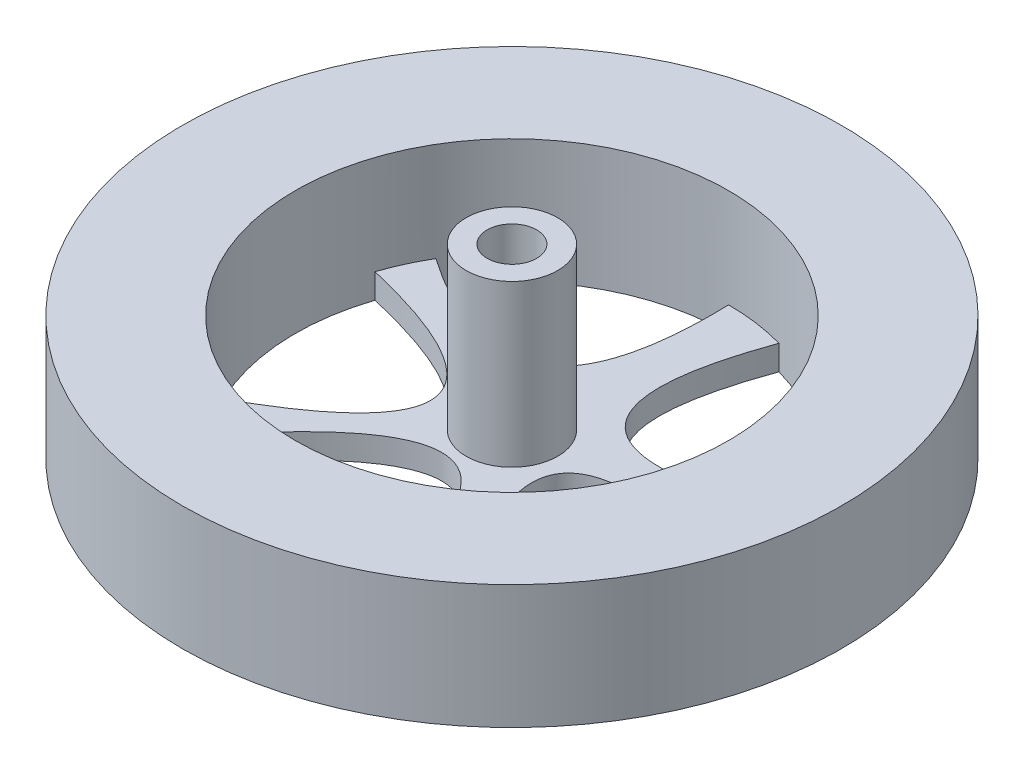
ISO-10303-21;
HEADER;
FILE_DESCRIPTION(('STEP AP214'),'2;1');
FILE_NAME('part.step','',(''),(''),'','','');
FILE_SCHEMA(('AUTOMOTIVE_DESIGN { 1 0 10303 214 1 1 1 1 }'));
ENDSEC;
DATA;
#1=APPLICATION_CONTEXT('core data for automotive mechanical design processes');
#2=APPLICATION_PROTOCOL_DEFINITION('international standard','automotive_design',2000,#1);
#3=PRODUCT_CONTEXT('',#1,'mechanical');
#4=PRODUCT('Part','Part','',(#3));
#5=PRODUCT_RELATED_PRODUCT_CATEGORY('part','',(#4));
#6=PRODUCT_DEFINITION_FORMATION('','',#4);
#7=PRODUCT_DEFINITION_CONTEXT('part definition',#1,'design');
#8=PRODUCT_DEFINITION('design','',#6,#7);
#9=PRODUCT_DEFINITION_SHAPE('','',#8);
#10=(LENGTH_UNIT() NAMED_UNIT(*) SI_UNIT(.MILLI.,.METRE.));
#11=(NAMED_UNIT(*) PLANE_ANGLE_UNIT() SI_UNIT($,.RADIAN.));
#12=(NAMED_UNIT(*) SI_UNIT($,.STERADIAN.) SOLID_ANGLE_UNIT());
#13=UNCERTAINTY_MEASURE_WITH_UNIT(LENGTH_MEASURE(1.E-05),#10,'distance_accuracy_value','');
#14=(GEOMETRIC_REPRESENTATION_CONTEXT(3) GLOBAL_UNCERTAINTY_ASSIGNED_CONTEXT((#13)) GLOBAL_UNIT_ASSIGNED_CONTEXT((#10,
#11,#12)) REPRESENTATION_CONTEXT('',''));
#15=CARTESIAN_POINT('',(0.,0.,0.));
#16=DIRECTION('',(0.,0.,1.));
#17=DIRECTION('',(1.,0.,0.));
#18=AXIS2_PLACEMENT_3D('',#15,#16,#17);
#19=CARTESIAN_POINT('',(0.,12.7,0.));
#20=DIRECTION('',(0.,1.,0.));
#21=DIRECTION('',(0.,0.,1.));
#22=AXIS2_PLACEMENT_3D('',#19,#20,#21);
#23=PLANE('',#22);
#24=CARTESIAN_POINT('',(0.,12.7,0.));
#25=DIRECTION('',(0.,1.,0.));
#26=DIRECTION('',(0.,0.,1.));
#27=AXIS2_PLACEMENT_3D('',#24,#25,#26);
#28=CIRCLE('',#27,22.225);
#29=CARTESIAN_POINT('',(0.,12.7,22.225));
#30=VERTEX_POINT('',#29);
#31=EDGE_CURVE('E156',#30,#30,#28,.T.);
#32=ORIENTED_EDGE('',*,*,#31,.F.);
#33=EDGE_LOOP('',(#32));
#34=FACE_BOUND('',#33,.T.);
#35=CARTESIAN_POINT('',(0.,12.7,0.));
#36=DIRECTION('',(0.,1.,0.));
#37=DIRECTION('',(0.,0.,1.));
#38=AXIS2_PLACEMENT_3D('',#35,#36,#37);
#39=CIRCLE('',#38,33.8154432214627);
#40=CARTESIAN_POINT('',(0.,12.7,33.8154432214627));
#41=VERTEX_POINT('',#40);
#42=EDGE_CURVE('E268',#41,#41,#39,.T.);
#43=ORIENTED_EDGE('',*,*,#42,.T.);
#44=EDGE_LOOP('',(#43));
#45=FACE_BOUND('',#44,.T.);
#46=ADVANCED_FACE('F37',(#34,#45),#23,.T.);
#47=CARTESIAN_POINT('',(0.,0.,0.));
#48=DIRECTION('',(0.,1.,0.));
#49=DIRECTION('',(0.,0.,1.));
#50=AXIS2_PLACEMENT_3D('',#47,#48,#49);
#51=PLANE('',#50);
#52=CARTESIAN_POINT('',(0.,0.,0.));
#53=DIRECTION('',(0.,1.,0.));
#54=DIRECTION('',(0.,0.,1.));
#55=AXIS2_PLACEMENT_3D('',#52,#53,#54);
#56=CIRCLE('',#55,22.225);
#57=CARTESIAN_POINT('',(-15.2293856189321,0.,16.1869218404817));
#58=VERTEX_POINT('',#57);
#59=CARTESIAN_POINT('',(6.54883982763627,0.,21.2382513854593));
#60=VERTEX_POINT('',#59);
#61=EDGE_CURVE('E47',#58,#60,#56,.T.);
#62=ORIENTED_EDGE('',*,*,#61,.T.);
#63=CARTESIAN_POINT('',(6.54883982763627,0.,21.2382513854593));
#64=CARTESIAN_POINT('',(3.30751914065048,0.,-7.25964373598122));
#65=CARTESIAN_POINT('',(-15.2293856189321,0.,16.1869218404817));
#66=B_SPLINE_CURVE_WITH_KNOTS('',2,(#63,#64,#65),.UNSPECIFIED.,.F.,.F.,(3,3),(0.,1.),.UNSPECIFIED.);
#67=EDGE_CURVE('E11',#60,#58,#66,.T.);
#68=ORIENTED_EDGE('',*,*,#67,.T.);
#69=EDGE_LOOP('',(#62,#68));
#70=FACE_BOUND('',#69,.T.);
#71=CARTESIAN_POINT('',(0.,0.,0.));
#72=DIRECTION('',(0.,1.,0.));
#73=DIRECTION('',(0.,0.,1.));
#74=AXIS2_PLACEMENT_3D('',#71,#72,#73);
#75=CIRCLE('',#74,22.225);
#76=CARTESIAN_POINT('',(-21.079996900113,0.,-7.04161598578241));
#77=VERTEX_POINT('',#76);
#78=CARTESIAN_POINT('',(-18.3725185408467,0.,12.5060460364675));
#79=VERTEX_POINT('',#78);
#80=EDGE_CURVE('E185',#77,#79,#75,.T.);
#81=ORIENTED_EDGE('',*,*,#80,.T.);
#82=CARTESIAN_POINT('',(-18.3725185408467,0.,12.5060460364675));
#83=CARTESIAN_POINT('',(6.06747010412446,0.,-0.607937187487216));
#84=CARTESIAN_POINT('',(-21.079996900113,0.,-7.0416159857824));
#85=B_SPLINE_CURVE_WITH_KNOTS('',2,(#82,#83,#84),.UNSPECIFIED.,.F.,.F.,(3,3),(0.,1.),.UNSPECIFIED.);
#86=EDGE_CURVE('E191',#79,#77,#85,.T.);
#87=ORIENTED_EDGE('',*,*,#86,.T.);
#88=EDGE_LOOP('',(#81,#87));
#89=FACE_BOUND('',#88,.T.);
#90=CARTESIAN_POINT('',(0.,0.,0.));
#91=DIRECTION('',(0.,1.,0.));
#92=DIRECTION('',(0.,0.,1.));
#93=AXIS2_PLACEMENT_3D('',#90,#91,#92);
#94=CIRCLE('',#93,22.225);
#95=CARTESIAN_POINT('',(21.254913666616,0.,-6.49455695368821));
#96=VERTEX_POINT('',#95);
#97=CARTESIAN_POINT('',(5.99758088653269,0.,-21.4004590724007));
#98=VERTEX_POINT('',#97);
#99=EDGE_CURVE('E126',#96,#98,#94,.T.);
#100=ORIENTED_EDGE('',*,*,#99,.T.);
#101=CARTESIAN_POINT('',(5.99758088653269,0.,-21.4004590724007));
#102=CARTESIAN_POINT('',(-2.42474022638234,0.,1.90728539073849));
#103=CARTESIAN_POINT('',(21.254913666616,0.,-6.49455695368821));
#104=B_SPLINE_CURVE_WITH_KNOTS('',2,(#101,#102,#103),.UNSPECIFIED.,.F.,.F.,(3,3),(0.,1.),.UNSPECIFIED.);
#105=EDGE_CURVE('E181',#98,#96,#104,.T.);
#106=ORIENTED_EDGE('',*,*,#105,.T.);
#107=EDGE_LOOP('',(#100,#106));
#108=FACE_BOUND('',#107,.T.);
#109=CARTESIAN_POINT('',(0.,0.,0.));
#110=DIRECTION('',(0.,1.,0.));
#111=DIRECTION('',(0.,0.,1.));
#112=AXIS2_PLACEMENT_3D('',#109,#110,#111);
#113=CIRCLE('',#112,22.225);
#114=CARTESIAN_POINT('',(13.0505516160066,0.,17.9898228873424));
#115=VERTEX_POINT('',#114);
#116=CARTESIAN_POINT('',(22.1963633916059,0.,1.12786399347593));
#117=VERTEX_POINT('',#116);
#118=EDGE_CURVE('E166',#115,#117,#113,.T.);
#119=ORIENTED_EDGE('',*,*,#118,.T.);
#120=CARTESIAN_POINT('',(22.1963633916059,0.,1.12786399347593));
#121=CARTESIAN_POINT('',(-5.30189953956152,0.,-6.17203652356502));
#122=CARTESIAN_POINT('',(13.0505516160066,0.,17.9898228873424));
#123=B_SPLINE_CURVE_WITH_KNOTS('',2,(#120,#121,#122),.UNSPECIFIED.,.F.,.F.,(3,3),(0.,1.),.UNSPECIFIED.);
#124=EDGE_CURVE('E172',#117,#115,#123,.T.);
#125=ORIENTED_EDGE('',*,*,#124,.T.);
#126=EDGE_LOOP('',(#119,#125));
#127=FACE_BOUND('',#126,.T.);
#128=CARTESIAN_POINT('',(0.,0.,0.));
#129=DIRECTION('',(0.,1.,0.));
#130=DIRECTION('',(0.,0.,1.));
#131=AXIS2_PLACEMENT_3D('',#128,#129,#130);
#132=CIRCLE('',#131,22.225);
#133=CARTESIAN_POINT('',(0.,0.,-22.225));
#134=VERTEX_POINT('',#133);
#135=CARTESIAN_POINT('',(-19.1251062236959,0.,-11.3217020333671));
#136=VERTEX_POINT('',#135);
#137=EDGE_CURVE('E149',#134,#136,#132,.T.);
#138=ORIENTED_EDGE('',*,*,#137,.T.);
#139=CARTESIAN_POINT('',(-19.1251062236959,0.,-11.3217020333671));
#140=CARTESIAN_POINT('',(0.733559441397432,0.,2.41928865365835));
#141=CARTESIAN_POINT('',(0.,0.,-22.225));
#142=B_SPLINE_CURVE_WITH_KNOTS('',2,(#139,#140,#141),.UNSPECIFIED.,.F.,.F.,(3,3),(0.,1.),.UNSPECIFIED.);
#143=EDGE_CURVE('E161',#136,#134,#142,.T.);
#144=ORIENTED_EDGE('',*,*,#143,.T.);
#145=EDGE_LOOP('',(#138,#144));
#146=FACE_BOUND('',#145,.T.);
#147=CARTESIAN_POINT('',(0.,0.,0.));
#148=DIRECTION('',(0.,1.,0.));
#149=DIRECTION('',(0.,0.,1.));
#150=AXIS2_PLACEMENT_3D('',#147,#148,#149);
#151=CIRCLE('',#150,33.8154432214627);
#152=CARTESIAN_POINT('',(0.,0.,33.8154432214627));
#153=VERTEX_POINT('',#152);
#154=EDGE_CURVE('E266',#153,#153,#151,.T.);
#155=ORIENTED_EDGE('',*,*,#154,.F.);
#156=EDGE_LOOP('',(#155));
#157=FACE_BOUND('',#156,.T.);
#158=ADVANCED_FACE('F39',(#70,#89,#108,#127,#146,#157),#51,.F.);
#159=CARTESIAN_POINT('',(0.,2.54,0.));
#160=DIRECTION('',(0.,1.,0.));
#161=DIRECTION('',(0.,0.,1.));
#162=AXIS2_PLACEMENT_3D('',#159,#160,#161);
#163=CYLINDRICAL_SURFACE('',#162,22.225);
#164=CARTESIAN_POINT('',(0.,2.54,0.));
#165=DIRECTION('',(0.,1.,0.));
#166=DIRECTION('',(0.,0.,1.));
#167=AXIS2_PLACEMENT_3D('',#164,#165,#166);
#168=CIRCLE('',#167,22.225);
#169=CARTESIAN_POINT('',(6.54883982763627,2.54,21.2382513854593));
#170=VERTEX_POINT('',#169);
#171=CARTESIAN_POINT('',(13.0505516160066,2.54,17.9898228873424));
#172=VERTEX_POINT('',#171);
#173=EDGE_CURVE('E146',#170,#172,#168,.T.);
#174=ORIENTED_EDGE('',*,*,#173,.F.);
#175=DIRECTION('',(0.,1.,0.));
#176=VECTOR('',#175,1.);
#177=CARTESIAN_POINT('',(6.54883982763627,-7.62,21.2382513854593));
#178=LINE('',#177,#176);
#179=EDGE_CURVE('E206',#60,#170,#178,.T.);
#180=ORIENTED_EDGE('',*,*,#179,.F.);
#181=ORIENTED_EDGE('',*,*,#61,.F.);
#182=DIRECTION('',(0.,1.,0.));
#183=VECTOR('',#182,1.);
#184=CARTESIAN_POINT('',(-15.2293856189321,-7.62,16.1869218404817));
#185=LINE('',#184,#183);
#186=CARTESIAN_POINT('',(-15.2293856189321,2.54,16.1869218404817));
#187=VERTEX_POINT('',#186);
#188=EDGE_CURVE('E204',#58,#187,#185,.T.);
#189=ORIENTED_EDGE('',*,*,#188,.T.);
#190=CARTESIAN_POINT('',(-18.3725185408467,2.54,12.5060460364675));
#191=VERTEX_POINT('',#190);
#192=EDGE_CURVE('E150',#191,#187,#168,.T.);
#193=ORIENTED_EDGE('',*,*,#192,.F.);
#194=DIRECTION('',(0.,1.,0.));
#195=VECTOR('',#194,1.);
#196=CARTESIAN_POINT('',(-18.3725185408467,-7.62,12.5060460364675));
#197=LINE('',#196,#195);
#198=EDGE_CURVE('E54',#79,#191,#197,.T.);
#199=ORIENTED_EDGE('',*,*,#198,.F.);
#200=ORIENTED_EDGE('',*,*,#80,.F.);
#201=DIRECTION('',(0.,1.,0.));
#202=VECTOR('',#201,1.);
#203=CARTESIAN_POINT('',(-21.079996900113,-7.62,-7.04161598578241));
#204=LINE('',#203,#202);
#205=CARTESIAN_POINT('',(-21.079996900113,2.54,-7.04161598578241));
#206=VERTEX_POINT('',#205);
#207=EDGE_CURVE('E245',#77,#206,#204,.T.);
#208=ORIENTED_EDGE('',*,*,#207,.T.);
#209=CARTESIAN_POINT('',(-19.1251062236959,2.54,-11.3217020333671));
#210=VERTEX_POINT('',#209);
#211=EDGE_CURVE('E151',#210,#206,#168,.T.);
#212=ORIENTED_EDGE('',*,*,#211,.F.);
#213=DIRECTION('',(0.,1.,0.));
#214=VECTOR('',#213,1.);
#215=CARTESIAN_POINT('',(-19.1251062236959,-7.62,-11.3217020333671));
#216=LINE('',#215,#214);
#217=EDGE_CURVE('E62',#136,#210,#216,.T.);
#218=ORIENTED_EDGE('',*,*,#217,.F.);
#219=ORIENTED_EDGE('',*,*,#137,.F.);
#220=DIRECTION('',(0.,1.,0.));
#221=VECTOR('',#220,1.);
#222=CARTESIAN_POINT('',(0.,-7.62,-22.225));
#223=LINE('',#222,#221);
#224=CARTESIAN_POINT('',(0.,2.54,-22.225));
#225=VERTEX_POINT('',#224);
#226=EDGE_CURVE('E154',#134,#225,#223,.T.);
#227=ORIENTED_EDGE('',*,*,#226,.T.);
#228=CARTESIAN_POINT('',(5.99758088653269,2.54,-21.4004590724007));
#229=VERTEX_POINT('',#228);
#230=EDGE_CURVE('E147',#229,#225,#168,.T.);
#231=ORIENTED_EDGE('',*,*,#230,.F.);
#232=DIRECTION('',(0.,1.,0.));
#233=VECTOR('',#232,1.);
#234=CARTESIAN_POINT('',(5.99758088653269,-7.62,-21.4004590724007));
#235=LINE('',#234,#233);
#236=EDGE_CURVE('E130',#98,#229,#235,.T.);
#237=ORIENTED_EDGE('',*,*,#236,.F.);
#238=ORIENTED_EDGE('',*,*,#99,.F.);
#239=DIRECTION('',(0.,1.,0.));
#240=VECTOR('',#239,1.);
#241=CARTESIAN_POINT('',(21.254913666616,-7.62,-6.49455695368821));
#242=LINE('',#241,#240);
#243=CARTESIAN_POINT('',(21.254913666616,2.54,-6.49455695368821));
#244=VERTEX_POINT('',#243);
#245=EDGE_CURVE('E118',#96,#244,#242,.T.);
#246=ORIENTED_EDGE('',*,*,#245,.T.);
#247=CARTESIAN_POINT('',(22.1963633916059,2.54,1.12786399347593));
#248=VERTEX_POINT('',#247);
#249=EDGE_CURVE('E124',#248,#244,#168,.T.);
#250=ORIENTED_EDGE('',*,*,#249,.F.);
#251=DIRECTION('',(0.,1.,0.));
#252=VECTOR('',#251,1.);
#253=CARTESIAN_POINT('',(22.1963633916059,-7.62,1.12786399347593));
#254=LINE('',#253,#252);
#255=EDGE_CURVE('E214',#117,#248,#254,.T.);
#256=ORIENTED_EDGE('',*,*,#255,.F.);
#257=ORIENTED_EDGE('',*,*,#118,.F.);
#258=DIRECTION('',(0.,1.,0.));
#259=VECTOR('',#258,1.);
#260=CARTESIAN_POINT('',(13.0505516160066,-7.62,17.9898228873424));
#261=LINE('',#260,#259);
#262=EDGE_CURVE('E311',#115,#172,#261,.T.);
#263=ORIENTED_EDGE('',*,*,#262,.T.);
#264=EDGE_LOOP('',(#174,#180,#181,#189,#193,#199,#200,#208,#212,#218,#219,#227,#231,#237,#238,
#246,#250,#256,#257,#263));
#265=FACE_BOUND('',#264,.T.);
#266=ORIENTED_EDGE('',*,*,#31,.T.);
#267=EDGE_LOOP('',(#266));
#268=FACE_BOUND('',#267,.T.);
#269=ADVANCED_FACE('F121',(#265,#268),#163,.F.);
#270=CARTESIAN_POINT('',(0.,2.54,0.));
#271=DIRECTION('',(0.,1.,0.));
#272=DIRECTION('',(0.,0.,1.));
#273=AXIS2_PLACEMENT_3D('',#270,#271,#272);
#274=PLANE('',#273);
#275=CARTESIAN_POINT('',(0.,2.54,0.));
#276=DIRECTION('',(0.,1.,0.));
#277=DIRECTION('',(0.,0.,1.));
#278=AXIS2_PLACEMENT_3D('',#275,#276,#277);
#279=CIRCLE('',#278,4.6947613472291);
#280=CARTESIAN_POINT('',(0.,2.54,4.6947613472291));
#281=VERTEX_POINT('',#280);
#282=EDGE_CURVE('E277',#281,#281,#279,.T.);
#283=ORIENTED_EDGE('',*,*,#282,.F.);
#284=EDGE_LOOP('',(#283));
#285=FACE_BOUND('',#284,.T.);
#286=CARTESIAN_POINT('',(6.54883982763627,2.54,21.2382513854593));
#287=CARTESIAN_POINT('',(3.30751914065048,2.54,-7.25964373598122));
#288=CARTESIAN_POINT('',(-15.2293856189321,2.54,16.1869218404817));
#289=B_SPLINE_CURVE_WITH_KNOTS('',2,(#286,#287,#288),.UNSPECIFIED.,.F.,.F.,(3,3),(0.,1.),.UNSPECIFIED.);
#290=EDGE_CURVE('E209',#170,#187,#289,.T.);
#291=ORIENTED_EDGE('',*,*,#290,.F.);
#292=ORIENTED_EDGE('',*,*,#173,.T.);
#293=CARTESIAN_POINT('',(22.1963633916059,2.54,1.12786399347593));
#294=CARTESIAN_POINT('',(-5.30189953956152,2.54,-6.17203652356502));
#295=CARTESIAN_POINT('',(13.0505516160066,2.54,17.9898228873424));
#296=B_SPLINE_CURVE_WITH_KNOTS('',2,(#293,#294,#295),.UNSPECIFIED.,.F.,.F.,(3,3),(0.,1.),.UNSPECIFIED.);
#297=EDGE_CURVE('E145',#248,#172,#296,.T.);
#298=ORIENTED_EDGE('',*,*,#297,.F.);
#299=ORIENTED_EDGE('',*,*,#249,.T.);
#300=CARTESIAN_POINT('',(5.99758088653269,2.54,-21.4004590724007));
#301=CARTESIAN_POINT('',(-2.42474022638234,2.54,1.90728539073849));
#302=CARTESIAN_POINT('',(21.254913666616,2.54,-6.49455695368821));
#303=B_SPLINE_CURVE_WITH_KNOTS('',2,(#300,#301,#302),.UNSPECIFIED.,.F.,.F.,(3,3),(0.,1.),.UNSPECIFIED.);
#304=EDGE_CURVE('E131',#229,#244,#303,.T.);
#305=ORIENTED_EDGE('',*,*,#304,.F.);
#306=ORIENTED_EDGE('',*,*,#230,.T.);
#307=CARTESIAN_POINT('',(-19.1251062236959,2.54,-11.3217020333671));
#308=CARTESIAN_POINT('',(0.733559441397432,2.54,2.41928865365835));
#309=CARTESIAN_POINT('',(0.,2.54,-22.225));
#310=B_SPLINE_CURVE_WITH_KNOTS('',2,(#307,#308,#309),.UNSPECIFIED.,.F.,.F.,(3,3),(0.,1.),.UNSPECIFIED.);
#311=EDGE_CURVE('E246',#210,#225,#310,.T.);
#312=ORIENTED_EDGE('',*,*,#311,.F.);
#313=ORIENTED_EDGE('',*,*,#211,.T.);
#314=CARTESIAN_POINT('',(-18.3725185408467,2.54,12.5060460364675));
#315=CARTESIAN_POINT('',(6.06747010412446,2.54,-0.607937187487216));
#316=CARTESIAN_POINT('',(-21.079996900113,2.54,-7.0416159857824));
#317=B_SPLINE_CURVE_WITH_KNOTS('',2,(#314,#315,#316),.UNSPECIFIED.,.F.,.F.,(3,3),(0.,1.),.UNSPECIFIED.);
#318=EDGE_CURVE('E212',#191,#206,#317,.T.);
#319=ORIENTED_EDGE('',*,*,#318,.F.);
#320=ORIENTED_EDGE('',*,*,#192,.T.);
#321=EDGE_LOOP('',(#291,#292,#298,#299,#305,#306,#312,#313,#319,#320));
#322=FACE_BOUND('',#321,.T.);
#323=ADVANCED_FACE('F142',(#285,#322),#274,.T.);
#324=CARTESIAN_POINT('',(-19.1251062236959,-7.62,-11.3217020333671));
#325=CARTESIAN_POINT('',(0.733559441397432,-7.62,2.41928865365835));
#326=CARTESIAN_POINT('',(0.,-7.62,-22.225));
#327=B_SPLINE_CURVE_WITH_KNOTS('',2,(#324,#325,#326),.UNSPECIFIED.,.F.,.F.,(3,3),(0.,1.),.UNSPECIFIED.);
#328=DIRECTION('',(0.,1.,0.));
#329=VECTOR('',#328,1.);
#330=SURFACE_OF_LINEAR_EXTRUSION('',#327,#329);
#331=ORIENTED_EDGE('',*,*,#217,.T.);
#332=ORIENTED_EDGE('',*,*,#311,.T.);
#333=ORIENTED_EDGE('',*,*,#226,.F.);
#334=ORIENTED_EDGE('',*,*,#143,.F.);
#335=EDGE_LOOP('',(#331,#332,#333,#334));
#336=FACE_BOUND('',#335,.T.);
#337=ADVANCED_FACE('F234',(#336),#330,.F.);
#338=CARTESIAN_POINT('',(22.1963633916059,-7.62,1.12786399347593));
#339=CARTESIAN_POINT('',(-5.30189953956152,-7.62,-6.17203652356502));
#340=CARTESIAN_POINT('',(13.0505516160066,-7.62,17.9898228873424));
#341=B_SPLINE_CURVE_WITH_KNOTS('',2,(#338,#339,#340),.UNSPECIFIED.,.F.,.F.,(3,3),(0.,1.),.UNSPECIFIED.);
#342=DIRECTION('',(0.,1.,0.));
#343=VECTOR('',#342,1.);
#344=SURFACE_OF_LINEAR_EXTRUSION('',#341,#343);
#345=ORIENTED_EDGE('',*,*,#255,.T.);
#346=ORIENTED_EDGE('',*,*,#297,.T.);
#347=ORIENTED_EDGE('',*,*,#262,.F.);
#348=ORIENTED_EDGE('',*,*,#124,.F.);
#349=EDGE_LOOP('',(#345,#346,#347,#348));
#350=FACE_BOUND('',#349,.T.);
#351=ADVANCED_FACE('F238',(#350),#344,.F.);
#352=CARTESIAN_POINT('',(5.99758088653269,-7.62,-21.4004590724007));
#353=CARTESIAN_POINT('',(-2.42474022638234,-7.62,1.90728539073849));
#354=CARTESIAN_POINT('',(21.254913666616,-7.62,-6.49455695368821));
#355=B_SPLINE_CURVE_WITH_KNOTS('',2,(#352,#353,#354),.UNSPECIFIED.,.F.,.F.,(3,3),(0.,1.),.UNSPECIFIED.);
#356=DIRECTION('',(0.,1.,0.));
#357=VECTOR('',#356,1.);
#358=SURFACE_OF_LINEAR_EXTRUSION('',#355,#357);
#359=ORIENTED_EDGE('',*,*,#236,.T.);
#360=ORIENTED_EDGE('',*,*,#304,.T.);
#361=ORIENTED_EDGE('',*,*,#245,.F.);
#362=ORIENTED_EDGE('',*,*,#105,.F.);
#363=EDGE_LOOP('',(#359,#360,#361,#362));
#364=FACE_BOUND('',#363,.T.);
#365=ADVANCED_FACE('F134',(#364),#358,.F.);
#366=CARTESIAN_POINT('',(-18.3725185408467,-7.62,12.5060460364675));
#367=CARTESIAN_POINT('',(6.06747010412446,-7.62,-0.607937187487216));
#368=CARTESIAN_POINT('',(-21.079996900113,-7.62,-7.0416159857824));
#369=B_SPLINE_CURVE_WITH_KNOTS('',2,(#366,#367,#368),.UNSPECIFIED.,.F.,.F.,(3,3),(0.,1.),.UNSPECIFIED.);
#370=DIRECTION('',(0.,1.,0.));
#371=VECTOR('',#370,1.);
#372=SURFACE_OF_LINEAR_EXTRUSION('',#369,#371);
#373=ORIENTED_EDGE('',*,*,#198,.T.);
#374=ORIENTED_EDGE('',*,*,#318,.T.);
#375=ORIENTED_EDGE('',*,*,#207,.F.);
#376=ORIENTED_EDGE('',*,*,#86,.F.);
#377=EDGE_LOOP('',(#373,#374,#375,#376));
#378=FACE_BOUND('',#377,.T.);
#379=ADVANCED_FACE('F228',(#378),#372,.F.);
#380=CARTESIAN_POINT('',(6.54883982763627,-7.62,21.2382513854593));
#381=CARTESIAN_POINT('',(3.30751914065048,-7.62,-7.25964373598122));
#382=CARTESIAN_POINT('',(-15.2293856189321,-7.62,16.1869218404817));
#383=B_SPLINE_CURVE_WITH_KNOTS('',2,(#380,#381,#382),.UNSPECIFIED.,.F.,.F.,(3,3),(0.,1.),.UNSPECIFIED.);
#384=DIRECTION('',(0.,1.,0.));
#385=VECTOR('',#384,1.);
#386=SURFACE_OF_LINEAR_EXTRUSION('',#383,#385);
#387=ORIENTED_EDGE('',*,*,#179,.T.);
#388=ORIENTED_EDGE('',*,*,#290,.T.);
#389=ORIENTED_EDGE('',*,*,#188,.F.);
#390=ORIENTED_EDGE('',*,*,#67,.F.);
#391=EDGE_LOOP('',(#387,#388,#389,#390));
#392=FACE_BOUND('',#391,.T.);
#393=ADVANCED_FACE('F208',(#392),#386,.F.);
#394=CARTESIAN_POINT('',(0.,19.05,0.));
#395=DIRECTION('',(0.,-1.,0.));
#396=DIRECTION('',(0.,0.,-1.));
#397=AXIS2_PLACEMENT_3D('',#394,#395,#396);
#398=CYLINDRICAL_SURFACE('',#397,4.6947613472291);
#399=CARTESIAN_POINT('',(0.,19.05,0.));
#400=DIRECTION('',(0.,1.,0.));
#401=DIRECTION('',(0.,0.,1.));
#402=AXIS2_PLACEMENT_3D('',#399,#400,#401);
#403=CIRCLE('',#402,4.6947613472291);
#404=CARTESIAN_POINT('',(0.,19.05,4.6947613472291));
#405=VERTEX_POINT('',#404);
#406=EDGE_CURVE('E138',#405,#405,#403,.T.);
#407=ORIENTED_EDGE('',*,*,#406,.F.);
#408=EDGE_LOOP('',(#407));
#409=FACE_BOUND('',#408,.T.);
#410=ORIENTED_EDGE('',*,*,#282,.T.);
#411=EDGE_LOOP('',(#410));
#412=FACE_BOUND('',#411,.T.);
#413=ADVANCED_FACE('F296',(#409,#412),#398,.T.);
#414=CARTESIAN_POINT('',(0.,19.05,0.));
#415=DIRECTION('',(0.,1.,0.));
#416=DIRECTION('',(0.,0.,1.));
#417=AXIS2_PLACEMENT_3D('',#414,#415,#416);
#418=PLANE('',#417);
#419=CARTESIAN_POINT('',(0.,19.05,0.));
#420=DIRECTION('',(0.,1.,0.));
#421=DIRECTION('',(0.,0.,1.));
#422=AXIS2_PLACEMENT_3D('',#419,#420,#421);
#423=CIRCLE('',#422,2.54);
#424=CARTESIAN_POINT('',(0.,19.05,2.54));
#425=VERTEX_POINT('',#424);
#426=EDGE_CURVE('E271',#425,#425,#423,.T.);
#427=ORIENTED_EDGE('',*,*,#426,.F.);
#428=EDGE_LOOP('',(#427));
#429=FACE_BOUND('',#428,.T.);
#430=ORIENTED_EDGE('',*,*,#406,.T.);
#431=EDGE_LOOP('',(#430));
#432=FACE_BOUND('',#431,.T.);
#433=ADVANCED_FACE('F347',(#429,#432),#418,.T.);
#434=CARTESIAN_POINT('',(0.,8.89,0.));
#435=DIRECTION('',(0.,1.,0.));
#436=DIRECTION('',(0.,0.,1.));
#437=AXIS2_PLACEMENT_3D('',#434,#435,#436);
#438=CYLINDRICAL_SURFACE('',#437,2.54);
#439=CARTESIAN_POINT('',(0.,8.89,0.));
#440=DIRECTION('',(0.,1.,0.));
#441=DIRECTION('',(0.,0.,1.));
#442=AXIS2_PLACEMENT_3D('',#439,#440,#441);
#443=CIRCLE('',#442,2.54);
#444=CARTESIAN_POINT('',(0.,8.89,2.54));
#445=VERTEX_POINT('',#444);
#446=EDGE_CURVE('E274',#445,#445,#443,.T.);
#447=ORIENTED_EDGE('',*,*,#446,.F.);
#448=EDGE_LOOP('',(#447));
#449=FACE_BOUND('',#448,.T.);
#450=ORIENTED_EDGE('',*,*,#426,.T.);
#451=EDGE_LOOP('',(#450));
#452=FACE_BOUND('',#451,.T.);
#453=ADVANCED_FACE('F353',(#449,#452),#438,.F.);
#454=CARTESIAN_POINT('',(0.,8.89,0.));
#455=DIRECTION('',(0.,1.,0.));
#456=DIRECTION('',(0.,0.,1.));
#457=AXIS2_PLACEMENT_3D('',#454,#455,#456);
#458=PLANE('',#457);
#459=ORIENTED_EDGE('',*,*,#446,.T.);
#460=EDGE_LOOP('',(#459));
#461=FACE_BOUND('',#460,.T.);
#462=ADVANCED_FACE('F420',(#461),#458,.T.);
#463=CARTESIAN_POINT('',(0.,24.1378949770851,0.));
#464=DIRECTION('',(0.,1.,0.));
#465=DIRECTION('',(0.,0.,1.));
#466=AXIS2_PLACEMENT_3D('',#463,#464,#465);
#467=CYLINDRICAL_SURFACE('',#466,33.8154432214627);
#468=ORIENTED_EDGE('',*,*,#154,.T.);
#469=EDGE_LOOP('',(#468));
#470=FACE_BOUND('',#469,.T.);
#471=ORIENTED_EDGE('',*,*,#42,.F.);
#472=EDGE_LOOP('',(#471));
#473=FACE_BOUND('',#472,.T.);
#474=ADVANCED_FACE('F429',(#470,#473),#467,.T.);
#475=CLOSED_SHELL('',(#46,#158,#269,#323,#337,#351,#365,#379,#393,#413,#433,#453,#462,#474));
#476=MANIFOLD_SOLID_BREP('B2',#475);
#477=ADVANCED_BREP_SHAPE_REPRESENTATION('',(#18,#476),#14);
#478=SHAPE_DEFINITION_REPRESENTATION(#9,#477);
ENDSEC;
END-ISO-10303-21;
